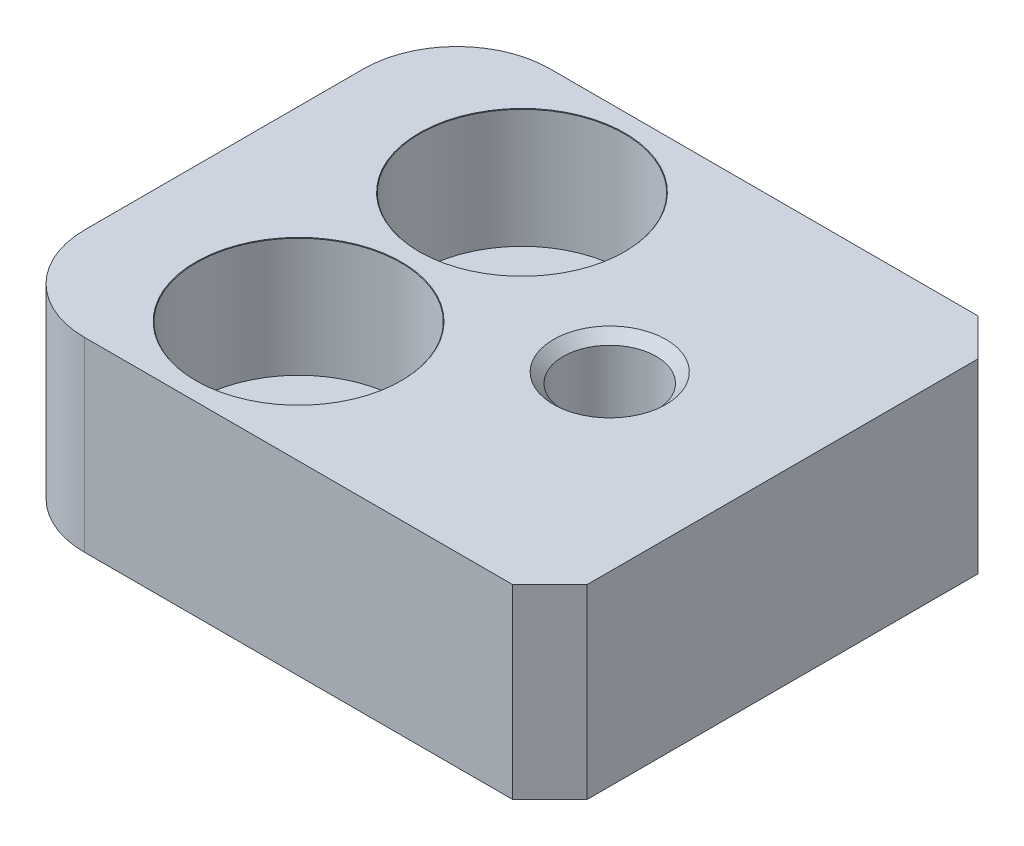
ISO-10303-21;
HEADER;
FILE_DESCRIPTION(('STEP AP214'),'2;1');
FILE_NAME('part.step','',(''),(''),'','','');
FILE_SCHEMA(('AUTOMOTIVE_DESIGN { 1 0 10303 214 1 1 1 1 }'));
ENDSEC;
DATA;
#1=APPLICATION_CONTEXT('core data for automotive mechanical design processes');
#2=APPLICATION_PROTOCOL_DEFINITION('international standard','automotive_design',2000,#1);
#3=PRODUCT_CONTEXT('',#1,'mechanical');
#4=PRODUCT('Part','Part','',(#3));
#5=PRODUCT_RELATED_PRODUCT_CATEGORY('part','',(#4));
#6=PRODUCT_DEFINITION_FORMATION('','',#4);
#7=PRODUCT_DEFINITION_CONTEXT('part definition',#1,'design');
#8=PRODUCT_DEFINITION('design','',#6,#7);
#9=PRODUCT_DEFINITION_SHAPE('','',#8);
#10=(LENGTH_UNIT() NAMED_UNIT(*) SI_UNIT(.MILLI.,.METRE.));
#11=(NAMED_UNIT(*) PLANE_ANGLE_UNIT() SI_UNIT($,.RADIAN.));
#12=(NAMED_UNIT(*) SI_UNIT($,.STERADIAN.) SOLID_ANGLE_UNIT());
#13=UNCERTAINTY_MEASURE_WITH_UNIT(LENGTH_MEASURE(1.E-05),#10,'distance_accuracy_value','');
#14=(GEOMETRIC_REPRESENTATION_CONTEXT(3) GLOBAL_UNCERTAINTY_ASSIGNED_CONTEXT((#13)) GLOBAL_UNIT_ASSIGNED_CONTEXT((#10,
#11,#12)) REPRESENTATION_CONTEXT('',''));
#15=CARTESIAN_POINT('',(0.,0.,0.));
#16=DIRECTION('',(0.,0.,1.));
#17=DIRECTION('',(1.,0.,0.));
#18=AXIS2_PLACEMENT_3D('',#15,#16,#17);
#19=CARTESIAN_POINT('',(-15.,10.,12.5));
#20=DIRECTION('',(1.,0.,0.));
#21=DIRECTION('',(0.,0.,-1.));
#22=AXIS2_PLACEMENT_3D('',#19,#20,#21);
#23=PLANE('',#22);
#24=DIRECTION('',(0.,0.,1.));
#25=VECTOR('',#24,1.);
#26=CARTESIAN_POINT('',(-15.,10.,12.5));
#27=LINE('',#26,#25);
#28=CARTESIAN_POINT('',(-15.,10.,-7.5));
#29=VERTEX_POINT('',#28);
#30=CARTESIAN_POINT('',(-15.,10.,7.5));
#31=VERTEX_POINT('',#30);
#32=EDGE_CURVE('E136',#29,#31,#27,.T.);
#33=ORIENTED_EDGE('',*,*,#32,.F.);
#34=DIRECTION('',(0.,-1.,0.));
#35=VECTOR('',#34,1.);
#36=CARTESIAN_POINT('',(-15.,10.,-7.5));
#37=LINE('',#36,#35);
#38=CARTESIAN_POINT('',(-15.,0.,-7.5));
#39=VERTEX_POINT('',#38);
#40=EDGE_CURVE('E122',#29,#39,#37,.T.);
#41=ORIENTED_EDGE('',*,*,#40,.T.);
#42=DIRECTION('',(0.,0.,1.));
#43=VECTOR('',#42,1.);
#44=CARTESIAN_POINT('',(-15.,0.,12.5));
#45=LINE('',#44,#43);
#46=CARTESIAN_POINT('',(-15.,0.,7.5));
#47=VERTEX_POINT('',#46);
#48=EDGE_CURVE('E133',#39,#47,#45,.T.);
#49=ORIENTED_EDGE('',*,*,#48,.T.);
#50=DIRECTION('',(0.,-1.,0.));
#51=VECTOR('',#50,1.);
#52=CARTESIAN_POINT('',(-15.,10.,7.5));
#53=LINE('',#52,#51);
#54=EDGE_CURVE('E137',#47,#31,#53,.F.);
#55=ORIENTED_EDGE('',*,*,#54,.T.);
#56=EDGE_LOOP('',(#33,#41,#49,#55));
#57=FACE_BOUND('',#56,.T.);
#58=ADVANCED_FACE('F49',(#57),#23,.F.);
#59=CARTESIAN_POINT('',(-15.,10.,12.5));
#60=DIRECTION('',(0.,0.,-1.));
#61=DIRECTION('',(-1.,0.,0.));
#62=AXIS2_PLACEMENT_3D('',#59,#60,#61);
#63=PLANE('',#62);
#64=DIRECTION('',(1.,0.,0.));
#65=VECTOR('',#64,1.);
#66=CARTESIAN_POINT('',(-15.,0.,12.5));
#67=LINE('',#66,#65);
#68=CARTESIAN_POINT('',(-10.,0.,12.5));
#69=VERTEX_POINT('',#68);
#70=CARTESIAN_POINT('',(13.,0.,12.5));
#71=VERTEX_POINT('',#70);
#72=EDGE_CURVE('E141',#69,#71,#67,.T.);
#73=ORIENTED_EDGE('',*,*,#72,.T.);
#74=DIRECTION('',(0.,1.,0.));
#75=VECTOR('',#74,1.);
#76=CARTESIAN_POINT('',(13.,10.,12.5));
#77=LINE('',#76,#75);
#78=CARTESIAN_POINT('',(13.,10.,12.5));
#79=VERTEX_POINT('',#78);
#80=EDGE_CURVE('E11',#71,#79,#77,.T.);
#81=ORIENTED_EDGE('',*,*,#80,.T.);
#82=DIRECTION('',(1.,0.,0.));
#83=VECTOR('',#82,1.);
#84=CARTESIAN_POINT('',(-15.,10.,12.5));
#85=LINE('',#84,#83);
#86=CARTESIAN_POINT('',(-10.,10.,12.5));
#87=VERTEX_POINT('',#86);
#88=EDGE_CURVE('E195',#87,#79,#85,.T.);
#89=ORIENTED_EDGE('',*,*,#88,.F.);
#90=DIRECTION('',(0.,-1.,0.));
#91=VECTOR('',#90,1.);
#92=CARTESIAN_POINT('',(-10.,10.,12.5));
#93=LINE('',#92,#91);
#94=EDGE_CURVE('E163',#87,#69,#93,.T.);
#95=ORIENTED_EDGE('',*,*,#94,.T.);
#96=EDGE_LOOP('',(#73,#81,#89,#95));
#97=FACE_BOUND('',#96,.T.);
#98=ADVANCED_FACE('F193',(#97),#63,.F.);
#99=CARTESIAN_POINT('',(15.,10.,12.5));
#100=DIRECTION('',(-1.,0.,0.));
#101=DIRECTION('',(0.,0.,1.));
#102=AXIS2_PLACEMENT_3D('',#99,#100,#101);
#103=PLANE('',#102);
#104=DIRECTION('',(0.,0.,-1.));
#105=VECTOR('',#104,1.);
#106=CARTESIAN_POINT('',(15.,0.,12.5));
#107=LINE('',#106,#105);
#108=CARTESIAN_POINT('',(15.,0.,10.5));
#109=VERTEX_POINT('',#108);
#110=CARTESIAN_POINT('',(15.,0.,-10.5));
#111=VERTEX_POINT('',#110);
#112=EDGE_CURVE('E144',#109,#111,#107,.T.);
#113=ORIENTED_EDGE('',*,*,#112,.T.);
#114=DIRECTION('',(0.,1.,0.));
#115=VECTOR('',#114,1.);
#116=CARTESIAN_POINT('',(15.,10.,-10.5));
#117=LINE('',#116,#115);
#118=CARTESIAN_POINT('',(15.,10.,-10.5));
#119=VERTEX_POINT('',#118);
#120=EDGE_CURVE('E71',#111,#119,#117,.T.);
#121=ORIENTED_EDGE('',*,*,#120,.T.);
#122=DIRECTION('',(0.,0.,-1.));
#123=VECTOR('',#122,1.);
#124=CARTESIAN_POINT('',(15.,10.,12.5));
#125=LINE('',#124,#123);
#126=CARTESIAN_POINT('',(15.,10.,10.5));
#127=VERTEX_POINT('',#126);
#128=EDGE_CURVE('E182',#127,#119,#125,.T.);
#129=ORIENTED_EDGE('',*,*,#128,.F.);
#130=DIRECTION('',(0.,-1.,0.));
#131=VECTOR('',#130,1.);
#132=CARTESIAN_POINT('',(15.,10.,10.5));
#133=LINE('',#132,#131);
#134=EDGE_CURVE('E173',#127,#109,#133,.T.);
#135=ORIENTED_EDGE('',*,*,#134,.T.);
#136=EDGE_LOOP('',(#113,#121,#129,#135));
#137=FACE_BOUND('',#136,.T.);
#138=ADVANCED_FACE('F189',(#137),#103,.F.);
#139=CARTESIAN_POINT('',(-15.,10.,-12.5));
#140=DIRECTION('',(0.,0.,1.));
#141=DIRECTION('',(1.,0.,0.));
#142=AXIS2_PLACEMENT_3D('',#139,#140,#141);
#143=PLANE('',#142);
#144=DIRECTION('',(-1.,0.,0.));
#145=VECTOR('',#144,1.);
#146=CARTESIAN_POINT('',(-15.,10.,-12.5));
#147=LINE('',#146,#145);
#148=CARTESIAN_POINT('',(13.,10.,-12.5));
#149=VERTEX_POINT('',#148);
#150=CARTESIAN_POINT('',(-10.,10.,-12.5));
#151=VERTEX_POINT('',#150);
#152=EDGE_CURVE('E150',#149,#151,#147,.T.);
#153=ORIENTED_EDGE('',*,*,#152,.F.);
#154=DIRECTION('',(0.,-1.,0.));
#155=VECTOR('',#154,1.);
#156=CARTESIAN_POINT('',(13.,10.,-12.5));
#157=LINE('',#156,#155);
#158=CARTESIAN_POINT('',(13.,0.,-12.5));
#159=VERTEX_POINT('',#158);
#160=EDGE_CURVE('E166',#149,#159,#157,.T.);
#161=ORIENTED_EDGE('',*,*,#160,.T.);
#162=DIRECTION('',(-1.,0.,0.));
#163=VECTOR('',#162,1.);
#164=CARTESIAN_POINT('',(-15.,0.,-12.5));
#165=LINE('',#164,#163);
#166=CARTESIAN_POINT('',(-10.,0.,-12.5));
#167=VERTEX_POINT('',#166);
#168=EDGE_CURVE('E154',#159,#167,#165,.T.);
#169=ORIENTED_EDGE('',*,*,#168,.T.);
#170=DIRECTION('',(0.,-1.,0.));
#171=VECTOR('',#170,1.);
#172=CARTESIAN_POINT('',(-10.,10.,-12.5));
#173=LINE('',#172,#171);
#174=EDGE_CURVE('E124',#167,#151,#173,.F.);
#175=ORIENTED_EDGE('',*,*,#174,.T.);
#176=EDGE_LOOP('',(#153,#161,#169,#175));
#177=FACE_BOUND('',#176,.T.);
#178=ADVANCED_FACE('F186',(#177),#143,.F.);
#179=CARTESIAN_POINT('',(0.,10.,0.));
#180=DIRECTION('',(0.,-1.,0.));
#181=DIRECTION('',(0.,0.,-1.));
#182=AXIS2_PLACEMENT_3D('',#179,#180,#181);
#183=PLANE('',#182);
#184=CARTESIAN_POINT('',(5.71516135158471,10.,0.));
#185=DIRECTION('',(0.,-1.,0.));
#186=DIRECTION('',(0.,0.,-1.));
#187=AXIS2_PLACEMENT_3D('',#184,#185,#186);
#188=CIRCLE('',#187,3.025);
#189=CARTESIAN_POINT('',(5.71516135158471,10.,-3.02500000000001));
#190=VERTEX_POINT('',#189);
#191=EDGE_CURVE('E243',#190,#190,#188,.T.);
#192=ORIENTED_EDGE('',*,*,#191,.T.);
#193=EDGE_LOOP('',(#192));
#194=FACE_BOUND('',#193,.T.);
#195=CARTESIAN_POINT('',(-5.,10.,-6.));
#196=DIRECTION('',(0.,1.,0.));
#197=DIRECTION('',(0.,0.,1.));
#198=AXIS2_PLACEMENT_3D('',#195,#196,#197);
#199=CIRCLE('',#198,5.525);
#200=CARTESIAN_POINT('',(-5.,10.,-0.475));
#201=VERTEX_POINT('',#200);
#202=EDGE_CURVE('E228',#201,#201,#199,.T.);
#203=ORIENTED_EDGE('',*,*,#202,.F.);
#204=EDGE_LOOP('',(#203));
#205=FACE_BOUND('',#204,.T.);
#206=CARTESIAN_POINT('',(-5.,10.,6.));
#207=DIRECTION('',(0.,1.,0.));
#208=DIRECTION('',(0.,0.,1.));
#209=AXIS2_PLACEMENT_3D('',#206,#207,#208);
#210=CIRCLE('',#209,5.525);
#211=CARTESIAN_POINT('',(-5.,10.,11.525));
#212=VERTEX_POINT('',#211);
#213=EDGE_CURVE('E210',#212,#212,#210,.T.);
#214=ORIENTED_EDGE('',*,*,#213,.F.);
#215=EDGE_LOOP('',(#214));
#216=FACE_BOUND('',#215,.T.);
#217=ORIENTED_EDGE('',*,*,#128,.T.);
#218=DIRECTION('',(0.707106781186548,0.,0.707106781186548));
#219=VECTOR('',#218,1.);
#220=CARTESIAN_POINT('',(13.,10.,-12.5));
#221=LINE('',#220,#219);
#222=EDGE_CURVE('E58',#119,#149,#221,.F.);
#223=ORIENTED_EDGE('',*,*,#222,.T.);
#224=ORIENTED_EDGE('',*,*,#152,.T.);
#225=CARTESIAN_POINT('',(-10.,10.,-7.5));
#226=DIRECTION('',(0.,-1.,0.));
#227=DIRECTION('',(0.,0.,-1.));
#228=AXIS2_PLACEMENT_3D('',#225,#226,#227);
#229=CIRCLE('',#228,5.);
#230=EDGE_CURVE('E161',#151,#29,#229,.F.);
#231=ORIENTED_EDGE('',*,*,#230,.T.);
#232=ORIENTED_EDGE('',*,*,#32,.T.);
#233=CARTESIAN_POINT('',(-10.,10.,7.5));
#234=DIRECTION('',(0.,-1.,0.));
#235=DIRECTION('',(0.,0.,-1.));
#236=AXIS2_PLACEMENT_3D('',#233,#234,#235);
#237=CIRCLE('',#236,5.);
#238=EDGE_CURVE('E159',#31,#87,#237,.F.);
#239=ORIENTED_EDGE('',*,*,#238,.T.);
#240=ORIENTED_EDGE('',*,*,#88,.T.);
#241=DIRECTION('',(-0.707106781186548,0.,0.707106781186547));
#242=VECTOR('',#241,1.);
#243=CARTESIAN_POINT('',(15.,10.,10.5));
#244=LINE('',#243,#242);
#245=EDGE_CURVE('E177',#79,#127,#244,.F.);
#246=ORIENTED_EDGE('',*,*,#245,.T.);
#247=EDGE_LOOP('',(#217,#223,#224,#231,#232,#239,#240,#246));
#248=FACE_BOUND('',#247,.T.);
#249=ADVANCED_FACE('F181',(#194,#205,#216,#248),#183,.F.);
#250=CARTESIAN_POINT('',(0.,0.,0.));
#251=DIRECTION('',(0.,-1.,0.));
#252=DIRECTION('',(0.,0.,-1.));
#253=AXIS2_PLACEMENT_3D('',#250,#251,#252);
#254=PLANE('',#253);
#255=CARTESIAN_POINT('',(5.71516135158471,0.,0.));
#256=DIRECTION('',(0.,-1.,0.));
#257=DIRECTION('',(0.,0.,-1.));
#258=AXIS2_PLACEMENT_3D('',#255,#256,#257);
#259=CIRCLE('',#258,3.025);
#260=CARTESIAN_POINT('',(5.71516135158471,0.,-3.02500000000001));
#261=VERTEX_POINT('',#260);
#262=EDGE_CURVE('E240',#261,#261,#259,.T.);
#263=ORIENTED_EDGE('',*,*,#262,.F.);
#264=EDGE_LOOP('',(#263));
#265=FACE_BOUND('',#264,.T.);
#266=CARTESIAN_POINT('',(-5.,0.,-6.));
#267=DIRECTION('',(0.,1.,0.));
#268=DIRECTION('',(0.,0.,1.));
#269=AXIS2_PLACEMENT_3D('',#266,#267,#268);
#270=CIRCLE('',#269,3.325);
#271=CARTESIAN_POINT('',(-5.,0.,-2.675));
#272=VERTEX_POINT('',#271);
#273=EDGE_CURVE('E231',#272,#272,#270,.T.);
#274=ORIENTED_EDGE('',*,*,#273,.T.);
#275=EDGE_LOOP('',(#274));
#276=FACE_BOUND('',#275,.T.);
#277=CARTESIAN_POINT('',(-5.,0.,6.));
#278=DIRECTION('',(0.,1.,0.));
#279=DIRECTION('',(0.,0.,1.));
#280=AXIS2_PLACEMENT_3D('',#277,#278,#279);
#281=CIRCLE('',#280,3.325);
#282=CARTESIAN_POINT('',(-5.,0.,9.325));
#283=VERTEX_POINT('',#282);
#284=EDGE_CURVE('E213',#283,#283,#281,.T.);
#285=ORIENTED_EDGE('',*,*,#284,.T.);
#286=EDGE_LOOP('',(#285));
#287=FACE_BOUND('',#286,.T.);
#288=ORIENTED_EDGE('',*,*,#168,.F.);
#289=DIRECTION('',(-0.707106781186548,0.,-0.707106781186548));
#290=VECTOR('',#289,1.);
#291=CARTESIAN_POINT('',(12.75,0.,-12.75));
#292=LINE('',#291,#290);
#293=EDGE_CURVE('E171',#159,#111,#292,.F.);
#294=ORIENTED_EDGE('',*,*,#293,.T.);
#295=ORIENTED_EDGE('',*,*,#112,.F.);
#296=DIRECTION('',(0.707106781186548,0.,-0.707106781186547));
#297=VECTOR('',#296,1.);
#298=CARTESIAN_POINT('',(12.75,0.,12.75));
#299=LINE('',#298,#297);
#300=EDGE_CURVE('E169',#109,#71,#299,.F.);
#301=ORIENTED_EDGE('',*,*,#300,.T.);
#302=ORIENTED_EDGE('',*,*,#72,.F.);
#303=CARTESIAN_POINT('',(-10.,0.,7.5));
#304=DIRECTION('',(0.,-1.,0.));
#305=DIRECTION('',(0.,0.,-1.));
#306=AXIS2_PLACEMENT_3D('',#303,#304,#305);
#307=CIRCLE('',#306,5.);
#308=EDGE_CURVE('E128',#69,#47,#307,.T.);
#309=ORIENTED_EDGE('',*,*,#308,.T.);
#310=ORIENTED_EDGE('',*,*,#48,.F.);
#311=CARTESIAN_POINT('',(-10.,0.,-7.5));
#312=DIRECTION('',(0.,-1.,0.));
#313=DIRECTION('',(0.,0.,-1.));
#314=AXIS2_PLACEMENT_3D('',#311,#312,#313);
#315=CIRCLE('',#314,5.);
#316=EDGE_CURVE('E118',#39,#167,#315,.T.);
#317=ORIENTED_EDGE('',*,*,#316,.T.);
#318=EDGE_LOOP('',(#288,#294,#295,#301,#302,#309,#310,#317));
#319=FACE_BOUND('',#318,.T.);
#320=ADVANCED_FACE('F139',(#265,#276,#287,#319),#254,.T.);
#321=CARTESIAN_POINT('',(-10.,10.,-7.5));
#322=DIRECTION('',(0.,-1.,0.));
#323=DIRECTION('',(0.,0.,-1.));
#324=AXIS2_PLACEMENT_3D('',#321,#322,#323);
#325=CYLINDRICAL_SURFACE('',#324,5.);
#326=ORIENTED_EDGE('',*,*,#230,.F.);
#327=ORIENTED_EDGE('',*,*,#174,.F.);
#328=ORIENTED_EDGE('',*,*,#316,.F.);
#329=ORIENTED_EDGE('',*,*,#40,.F.);
#330=EDGE_LOOP('',(#326,#327,#328,#329));
#331=FACE_BOUND('',#330,.T.);
#332=ADVANCED_FACE('F121',(#331),#325,.T.);
#333=CARTESIAN_POINT('',(-10.,10.,7.5));
#334=DIRECTION('',(0.,-1.,0.));
#335=DIRECTION('',(0.,0.,-1.));
#336=AXIS2_PLACEMENT_3D('',#333,#334,#335);
#337=CYLINDRICAL_SURFACE('',#336,5.);
#338=ORIENTED_EDGE('',*,*,#238,.F.);
#339=ORIENTED_EDGE('',*,*,#54,.F.);
#340=ORIENTED_EDGE('',*,*,#308,.F.);
#341=ORIENTED_EDGE('',*,*,#94,.F.);
#342=EDGE_LOOP('',(#338,#339,#340,#341));
#343=FACE_BOUND('',#342,.T.);
#344=ADVANCED_FACE('F198',(#343),#337,.T.);
#345=CARTESIAN_POINT('',(-5.,0.0250000000000042,6.));
#346=DIRECTION('',(0.,-1.,0.));
#347=DIRECTION('',(0.,0.,-1.));
#348=AXIS2_PLACEMENT_3D('',#345,#346,#347);
#349=CONICAL_SURFACE('',#348,3.3,0.785398163397422);
#350=ORIENTED_EDGE('',*,*,#284,.F.);
#351=EDGE_LOOP('',(#350));
#352=FACE_BOUND('',#351,.T.);
#353=CARTESIAN_POINT('',(-5.,0.0250000000000042,6.));
#354=DIRECTION('',(0.,1.,0.));
#355=DIRECTION('',(0.,0.,1.));
#356=AXIS2_PLACEMENT_3D('',#353,#354,#355);
#357=CIRCLE('',#356,3.3);
#358=CARTESIAN_POINT('',(-5.,0.0250000000000042,9.3));
#359=VERTEX_POINT('',#358);
#360=EDGE_CURVE('E142',#359,#359,#357,.T.);
#361=ORIENTED_EDGE('',*,*,#360,.T.);
#362=EDGE_LOOP('',(#361));
#363=FACE_BOUND('',#362,.T.);
#364=ADVANCED_FACE('F275',(#352,#363),#349,.F.);
#365=CARTESIAN_POINT('',(-5.,10.,6.));
#366=DIRECTION('',(0.,1.,0.));
#367=DIRECTION('',(0.,0.,1.));
#368=AXIS2_PLACEMENT_3D('',#365,#366,#367);
#369=CYLINDRICAL_SURFACE('',#368,3.3);
#370=ORIENTED_EDGE('',*,*,#360,.F.);
#371=EDGE_LOOP('',(#370));
#372=FACE_BOUND('',#371,.T.);
#373=CARTESIAN_POINT('',(-5.,3.6,6.));
#374=DIRECTION('',(0.,1.,0.));
#375=DIRECTION('',(0.,0.,1.));
#376=AXIS2_PLACEMENT_3D('',#373,#374,#375);
#377=CIRCLE('',#376,3.3);
#378=CARTESIAN_POINT('',(-5.,3.6,9.3));
#379=VERTEX_POINT('',#378);
#380=EDGE_CURVE('E147',#379,#379,#377,.T.);
#381=ORIENTED_EDGE('',*,*,#380,.T.);
#382=EDGE_LOOP('',(#381));
#383=FACE_BOUND('',#382,.T.);
#384=ADVANCED_FACE('F278',(#372,#383),#369,.F.);
#385=CARTESIAN_POINT('',(0.5,3.6,6.));
#386=DIRECTION('',(0.,-1.,0.));
#387=DIRECTION('',(0.,0.,-1.));
#388=AXIS2_PLACEMENT_3D('',#385,#386,#387);
#389=PLANE('',#388);
#390=ORIENTED_EDGE('',*,*,#380,.F.);
#391=EDGE_LOOP('',(#390));
#392=FACE_BOUND('',#391,.T.);
#393=CARTESIAN_POINT('',(-5.,3.6,6.));
#394=DIRECTION('',(0.,1.,0.));
#395=DIRECTION('',(0.,0.,1.));
#396=AXIS2_PLACEMENT_3D('',#393,#394,#395);
#397=CIRCLE('',#396,5.5);
#398=CARTESIAN_POINT('',(-5.,3.6,11.5));
#399=VERTEX_POINT('',#398);
#400=EDGE_CURVE('E204',#399,#399,#397,.T.);
#401=ORIENTED_EDGE('',*,*,#400,.T.);
#402=EDGE_LOOP('',(#401));
#403=FACE_BOUND('',#402,.T.);
#404=ADVANCED_FACE('F284',(#392,#403),#389,.F.);
#405=CARTESIAN_POINT('',(-5.,10.,6.));
#406=DIRECTION('',(0.,1.,0.));
#407=DIRECTION('',(0.,0.,1.));
#408=AXIS2_PLACEMENT_3D('',#405,#406,#407);
#409=CYLINDRICAL_SURFACE('',#408,5.5);
#410=ORIENTED_EDGE('',*,*,#400,.F.);
#411=EDGE_LOOP('',(#410));
#412=FACE_BOUND('',#411,.T.);
#413=CARTESIAN_POINT('',(-5.,9.975,6.));
#414=DIRECTION('',(0.,1.,0.));
#415=DIRECTION('',(0.,0.,1.));
#416=AXIS2_PLACEMENT_3D('',#413,#414,#415);
#417=CIRCLE('',#416,5.5);
#418=CARTESIAN_POINT('',(-5.,9.975,11.5));
#419=VERTEX_POINT('',#418);
#420=EDGE_CURVE('E207',#419,#419,#417,.T.);
#421=ORIENTED_EDGE('',*,*,#420,.T.);
#422=EDGE_LOOP('',(#421));
#423=FACE_BOUND('',#422,.T.);
#424=ADVANCED_FACE('F290',(#412,#423),#409,.F.);
#425=CARTESIAN_POINT('',(-5.,10.,6.));
#426=DIRECTION('',(0.,1.,0.));
#427=DIRECTION('',(0.,0.,1.));
#428=AXIS2_PLACEMENT_3D('',#425,#426,#427);
#429=CONICAL_SURFACE('',#428,5.525,0.785398163397466);
#430=ORIENTED_EDGE('',*,*,#420,.F.);
#431=EDGE_LOOP('',(#430));
#432=FACE_BOUND('',#431,.T.);
#433=ORIENTED_EDGE('',*,*,#213,.T.);
#434=EDGE_LOOP('',(#433));
#435=FACE_BOUND('',#434,.T.);
#436=ADVANCED_FACE('F296',(#432,#435),#429,.F.);
#437=CARTESIAN_POINT('',(-5.,0.0250000000000042,-6.));
#438=DIRECTION('',(0.,-1.,0.));
#439=DIRECTION('',(0.,0.,-1.));
#440=AXIS2_PLACEMENT_3D('',#437,#438,#439);
#441=CONICAL_SURFACE('',#440,3.3,0.785398163397422);
#442=ORIENTED_EDGE('',*,*,#273,.F.);
#443=EDGE_LOOP('',(#442));
#444=FACE_BOUND('',#443,.T.);
#445=CARTESIAN_POINT('',(-5.,0.0250000000000042,-6.));
#446=DIRECTION('',(0.,1.,0.));
#447=DIRECTION('',(0.,0.,1.));
#448=AXIS2_PLACEMENT_3D('',#445,#446,#447);
#449=CIRCLE('',#448,3.3);
#450=CARTESIAN_POINT('',(-5.,0.0250000000000042,-2.7));
#451=VERTEX_POINT('',#450);
#452=EDGE_CURVE('E216',#451,#451,#449,.T.);
#453=ORIENTED_EDGE('',*,*,#452,.T.);
#454=EDGE_LOOP('',(#453));
#455=FACE_BOUND('',#454,.T.);
#456=ADVANCED_FACE('F302',(#444,#455),#441,.F.);
#457=CARTESIAN_POINT('',(-5.,10.,-6.));
#458=DIRECTION('',(0.,1.,0.));
#459=DIRECTION('',(0.,0.,1.));
#460=AXIS2_PLACEMENT_3D('',#457,#458,#459);
#461=CYLINDRICAL_SURFACE('',#460,3.3);
#462=ORIENTED_EDGE('',*,*,#452,.F.);
#463=EDGE_LOOP('',(#462));
#464=FACE_BOUND('',#463,.T.);
#465=CARTESIAN_POINT('',(-5.,3.6,-6.));
#466=DIRECTION('',(0.,1.,0.));
#467=DIRECTION('',(0.,0.,1.));
#468=AXIS2_PLACEMENT_3D('',#465,#466,#467);
#469=CIRCLE('',#468,3.3);
#470=CARTESIAN_POINT('',(-5.,3.6,-2.7));
#471=VERTEX_POINT('',#470);
#472=EDGE_CURVE('E219',#471,#471,#469,.T.);
#473=ORIENTED_EDGE('',*,*,#472,.T.);
#474=EDGE_LOOP('',(#473));
#475=FACE_BOUND('',#474,.T.);
#476=ADVANCED_FACE('F387',(#464,#475),#461,.F.);
#477=CARTESIAN_POINT('',(0.5,3.6,-6.));
#478=DIRECTION('',(0.,-1.,0.));
#479=DIRECTION('',(0.,0.,-1.));
#480=AXIS2_PLACEMENT_3D('',#477,#478,#479);
#481=PLANE('',#480);
#482=ORIENTED_EDGE('',*,*,#472,.F.);
#483=EDGE_LOOP('',(#482));
#484=FACE_BOUND('',#483,.T.);
#485=CARTESIAN_POINT('',(-5.,3.6,-6.));
#486=DIRECTION('',(0.,1.,0.));
#487=DIRECTION('',(0.,0.,1.));
#488=AXIS2_PLACEMENT_3D('',#485,#486,#487);
#489=CIRCLE('',#488,5.5);
#490=CARTESIAN_POINT('',(-5.,3.6,-0.500000000000001));
#491=VERTEX_POINT('',#490);
#492=EDGE_CURVE('E222',#491,#491,#489,.T.);
#493=ORIENTED_EDGE('',*,*,#492,.T.);
#494=EDGE_LOOP('',(#493));
#495=FACE_BOUND('',#494,.T.);
#496=ADVANCED_FACE('F377',(#484,#495),#481,.F.);
#497=CARTESIAN_POINT('',(-5.,10.,-6.));
#498=DIRECTION('',(0.,1.,0.));
#499=DIRECTION('',(0.,0.,1.));
#500=AXIS2_PLACEMENT_3D('',#497,#498,#499);
#501=CYLINDRICAL_SURFACE('',#500,5.5);
#502=ORIENTED_EDGE('',*,*,#492,.F.);
#503=EDGE_LOOP('',(#502));
#504=FACE_BOUND('',#503,.T.);
#505=CARTESIAN_POINT('',(-5.,9.975,-6.));
#506=DIRECTION('',(0.,1.,0.));
#507=DIRECTION('',(0.,0.,1.));
#508=AXIS2_PLACEMENT_3D('',#505,#506,#507);
#509=CIRCLE('',#508,5.5);
#510=CARTESIAN_POINT('',(-5.,9.975,-0.500000000000001));
#511=VERTEX_POINT('',#510);
#512=EDGE_CURVE('E225',#511,#511,#509,.T.);
#513=ORIENTED_EDGE('',*,*,#512,.T.);
#514=EDGE_LOOP('',(#513));
#515=FACE_BOUND('',#514,.T.);
#516=ADVANCED_FACE('F367',(#504,#515),#501,.F.);
#517=CARTESIAN_POINT('',(-5.,10.,-6.));
#518=DIRECTION('',(0.,1.,0.));
#519=DIRECTION('',(0.,0.,1.));
#520=AXIS2_PLACEMENT_3D('',#517,#518,#519);
#521=CONICAL_SURFACE('',#520,5.525,0.785398163397466);
#522=ORIENTED_EDGE('',*,*,#512,.F.);
#523=EDGE_LOOP('',(#522));
#524=FACE_BOUND('',#523,.T.);
#525=ORIENTED_EDGE('',*,*,#202,.T.);
#526=EDGE_LOOP('',(#525));
#527=FACE_BOUND('',#526,.T.);
#528=ADVANCED_FACE('F253',(#524,#527),#521,.F.);
#529=CARTESIAN_POINT('',(5.71516135158471,9.475,0.));
#530=DIRECTION('',(0.,1.,0.));
#531=DIRECTION('',(0.,0.,1.));
#532=AXIS2_PLACEMENT_3D('',#529,#530,#531);
#533=CONICAL_SURFACE('',#532,2.5,0.785398163397447);
#534=ORIENTED_EDGE('',*,*,#191,.F.);
#535=EDGE_LOOP('',(#534));
#536=FACE_BOUND('',#535,.T.);
#537=CARTESIAN_POINT('',(5.71516135158471,9.475,0.));
#538=DIRECTION('',(0.,-1.,0.));
#539=DIRECTION('',(0.,0.,-1.));
#540=AXIS2_PLACEMENT_3D('',#537,#538,#539);
#541=CIRCLE('',#540,2.5);
#542=CARTESIAN_POINT('',(5.71516135158471,9.475,-2.5));
#543=VERTEX_POINT('',#542);
#544=EDGE_CURVE('E234',#543,#543,#541,.T.);
#545=ORIENTED_EDGE('',*,*,#544,.T.);
#546=EDGE_LOOP('',(#545));
#547=FACE_BOUND('',#546,.T.);
#548=ADVANCED_FACE('F249',(#536,#547),#533,.F.);
#549=CARTESIAN_POINT('',(5.71516135158471,0.,0.));
#550=DIRECTION('',(0.,-1.,0.));
#551=DIRECTION('',(0.,0.,-1.));
#552=AXIS2_PLACEMENT_3D('',#549,#550,#551);
#553=CYLINDRICAL_SURFACE('',#552,2.49999999999999);
#554=ORIENTED_EDGE('',*,*,#544,.F.);
#555=EDGE_LOOP('',(#554));
#556=FACE_BOUND('',#555,.T.);
#557=CARTESIAN_POINT('',(5.71516135158471,0.525000000000025,0.));
#558=DIRECTION('',(0.,-1.,0.));
#559=DIRECTION('',(0.,0.,-1.));
#560=AXIS2_PLACEMENT_3D('',#557,#558,#559);
#561=CIRCLE('',#560,2.49999999999999);
#562=CARTESIAN_POINT('',(5.71516135158471,0.525000000000025,-2.5));
#563=VERTEX_POINT('',#562);
#564=EDGE_CURVE('E237',#563,#563,#561,.T.);
#565=ORIENTED_EDGE('',*,*,#564,.T.);
#566=EDGE_LOOP('',(#565));
#567=FACE_BOUND('',#566,.T.);
#568=ADVANCED_FACE('F252',(#556,#567),#553,.F.);
#569=CARTESIAN_POINT('',(5.71516135158471,0.,0.));
#570=DIRECTION('',(0.,-1.,0.));
#571=DIRECTION('',(0.,0.,-1.));
#572=AXIS2_PLACEMENT_3D('',#569,#570,#571);
#573=CONICAL_SURFACE('',#572,3.025,0.785398163397433);
#574=ORIENTED_EDGE('',*,*,#564,.F.);
#575=EDGE_LOOP('',(#574));
#576=FACE_BOUND('',#575,.T.);
#577=ORIENTED_EDGE('',*,*,#262,.T.);
#578=EDGE_LOOP('',(#577));
#579=FACE_BOUND('',#578,.T.);
#580=ADVANCED_FACE('F259',(#576,#579),#573,.F.);
#581=CARTESIAN_POINT('',(13.,10.,-12.5));
#582=DIRECTION('',(-0.707106781186548,0.,0.707106781186548));
#583=DIRECTION('',(0.,-1.,0.));
#584=AXIS2_PLACEMENT_3D('',#581,#582,#583);
#585=PLANE('',#584);
#586=ORIENTED_EDGE('',*,*,#222,.F.);
#587=ORIENTED_EDGE('',*,*,#120,.F.);
#588=ORIENTED_EDGE('',*,*,#293,.F.);
#589=ORIENTED_EDGE('',*,*,#160,.F.);
#590=EDGE_LOOP('',(#586,#587,#588,#589));
#591=FACE_BOUND('',#590,.T.);
#592=ADVANCED_FACE('F187',(#591),#585,.F.);
#593=CARTESIAN_POINT('',(15.,10.,10.5));
#594=DIRECTION('',(-0.707106781186547,0.,-0.707106781186548));
#595=DIRECTION('',(0.,-1.,0.));
#596=AXIS2_PLACEMENT_3D('',#593,#594,#595);
#597=PLANE('',#596);
#598=ORIENTED_EDGE('',*,*,#245,.F.);
#599=ORIENTED_EDGE('',*,*,#80,.F.);
#600=ORIENTED_EDGE('',*,*,#300,.F.);
#601=ORIENTED_EDGE('',*,*,#134,.F.);
#602=EDGE_LOOP('',(#598,#599,#600,#601));
#603=FACE_BOUND('',#602,.T.);
#604=ADVANCED_FACE('F52',(#603),#597,.F.);
#605=CLOSED_SHELL('',(#58,#98,#138,#178,#249,#320,#332,#344,#364,#384,#404,#424,#436,#456,#476,
#496,#516,#528,#548,#568,#580,#592,#604));
#606=MANIFOLD_SOLID_BREP('B2',#605);
#607=ADVANCED_BREP_SHAPE_REPRESENTATION('',(#18,#606),#14);
#608=SHAPE_DEFINITION_REPRESENTATION(#9,#607);
ENDSEC;
END-ISO-10303-21;
